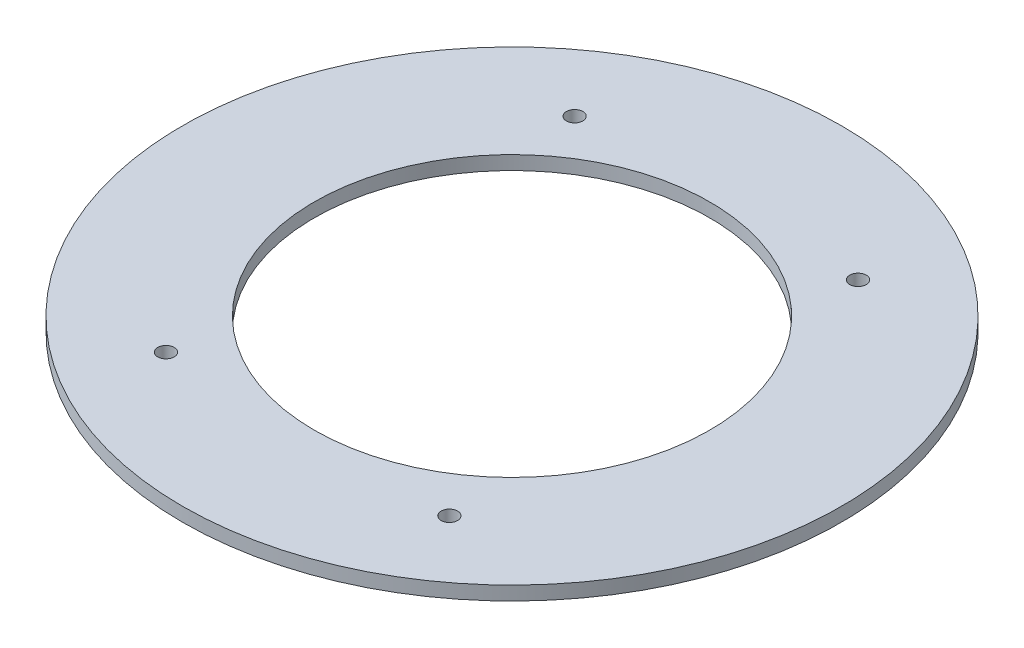
ISO-10303-21;
HEADER;
FILE_DESCRIPTION(('STEP AP214'),'2;1');
FILE_NAME('part.step','',(''),(''),'','','');
FILE_SCHEMA(('AUTOMOTIVE_DESIGN { 1 0 10303 214 1 1 1 1 }'));
ENDSEC;
DATA;
#1=APPLICATION_CONTEXT('core data for automotive mechanical design processes');
#2=APPLICATION_PROTOCOL_DEFINITION('international standard','automotive_design',2000,#1);
#3=PRODUCT_CONTEXT('',#1,'mechanical');
#4=PRODUCT('Part','Part','',(#3));
#5=PRODUCT_RELATED_PRODUCT_CATEGORY('part','',(#4));
#6=PRODUCT_DEFINITION_FORMATION('','',#4);
#7=PRODUCT_DEFINITION_CONTEXT('part definition',#1,'design');
#8=PRODUCT_DEFINITION('design','',#6,#7);
#9=PRODUCT_DEFINITION_SHAPE('','',#8);
#10=(LENGTH_UNIT() NAMED_UNIT(*) SI_UNIT(.MILLI.,.METRE.));
#11=(NAMED_UNIT(*) PLANE_ANGLE_UNIT() SI_UNIT($,.RADIAN.));
#12=(NAMED_UNIT(*) SI_UNIT($,.STERADIAN.) SOLID_ANGLE_UNIT());
#13=UNCERTAINTY_MEASURE_WITH_UNIT(LENGTH_MEASURE(1.E-05),#10,'distance_accuracy_value','');
#14=(GEOMETRIC_REPRESENTATION_CONTEXT(3) GLOBAL_UNCERTAINTY_ASSIGNED_CONTEXT((#13)) GLOBAL_UNIT_ASSIGNED_CONTEXT((#10,
#11,#12)) REPRESENTATION_CONTEXT('',''));
#15=CARTESIAN_POINT('',(0.,0.,0.));
#16=DIRECTION('',(0.,0.,1.));
#17=DIRECTION('',(1.,0.,0.));
#18=AXIS2_PLACEMENT_3D('',#15,#16,#17);
#19=CARTESIAN_POINT('',(0.,5.334,0.));
#20=DIRECTION('',(0.,-1.,0.));
#21=DIRECTION('',(0.,0.,-1.));
#22=AXIS2_PLACEMENT_3D('',#19,#20,#21);
#23=CYLINDRICAL_SURFACE('',#22,127.);
#24=CARTESIAN_POINT('',(0.,5.334,0.));
#25=DIRECTION('',(0.,1.,0.));
#26=DIRECTION('',(0.,0.,1.));
#27=AXIS2_PLACEMENT_3D('',#24,#25,#26);
#28=CIRCLE('',#27,127.);
#29=CARTESIAN_POINT('',(0.,5.334,127.));
#30=VERTEX_POINT('',#29);
#31=EDGE_CURVE('E10',#30,#30,#28,.T.);
#32=ORIENTED_EDGE('',*,*,#31,.F.);
#33=EDGE_LOOP('',(#32));
#34=FACE_BOUND('',#33,.T.);
#35=CARTESIAN_POINT('',(0.,0.,0.));
#36=DIRECTION('',(0.,1.,0.));
#37=DIRECTION('',(0.,0.,1.));
#38=AXIS2_PLACEMENT_3D('',#35,#36,#37);
#39=CIRCLE('',#38,127.);
#40=CARTESIAN_POINT('',(0.,0.,127.));
#41=VERTEX_POINT('',#40);
#42=EDGE_CURVE('E37',#41,#41,#39,.T.);
#43=ORIENTED_EDGE('',*,*,#42,.T.);
#44=EDGE_LOOP('',(#43));
#45=FACE_BOUND('',#44,.T.);
#46=ADVANCED_FACE('F30',(#34,#45),#23,.T.);
#47=CARTESIAN_POINT('',(0.,5.334,0.));
#48=DIRECTION('',(0.,1.,0.));
#49=DIRECTION('',(0.,0.,1.));
#50=AXIS2_PLACEMENT_3D('',#47,#48,#49);
#51=PLANE('',#50);
#52=CARTESIAN_POINT('',(-54.61,5.334,-78.74));
#53=DIRECTION('',(0.,-1.,0.));
#54=DIRECTION('',(0.,0.,1.));
#55=AXIS2_PLACEMENT_3D('',#52,#53,#54);
#56=CIRCLE('',#55,3.175);
#57=CARTESIAN_POINT('',(-54.61,5.334,-81.915));
#58=VERTEX_POINT('',#57);
#59=EDGE_CURVE('E67',#58,#58,#56,.T.);
#60=ORIENTED_EDGE('',*,*,#59,.T.);
#61=EDGE_LOOP('',(#60));
#62=FACE_BOUND('',#61,.T.);
#63=CARTESIAN_POINT('',(54.61,5.334,-78.74));
#64=DIRECTION('',(0.,-1.,0.));
#65=DIRECTION('',(0.,0.,-1.));
#66=AXIS2_PLACEMENT_3D('',#63,#64,#65);
#67=CIRCLE('',#66,3.175);
#68=CARTESIAN_POINT('',(54.61,5.334,-81.915));
#69=VERTEX_POINT('',#68);
#70=EDGE_CURVE('E57',#69,#69,#67,.T.);
#71=ORIENTED_EDGE('',*,*,#70,.T.);
#72=EDGE_LOOP('',(#71));
#73=FACE_BOUND('',#72,.T.);
#74=CARTESIAN_POINT('',(54.61,5.334,78.74));
#75=DIRECTION('',(0.,-1.,0.));
#76=DIRECTION('',(0.,0.,1.));
#77=AXIS2_PLACEMENT_3D('',#74,#75,#76);
#78=CIRCLE('',#77,3.175);
#79=CARTESIAN_POINT('',(54.61,5.334,75.565));
#80=VERTEX_POINT('',#79);
#81=EDGE_CURVE('E54',#80,#80,#78,.T.);
#82=ORIENTED_EDGE('',*,*,#81,.T.);
#83=EDGE_LOOP('',(#82));
#84=FACE_BOUND('',#83,.T.);
#85=CARTESIAN_POINT('',(-54.61,5.334,78.74));
#86=DIRECTION('',(0.,-1.,0.));
#87=DIRECTION('',(0.,0.,-1.));
#88=AXIS2_PLACEMENT_3D('',#85,#86,#87);
#89=CIRCLE('',#88,3.175);
#90=CARTESIAN_POINT('',(-54.61,5.334,75.565));
#91=VERTEX_POINT('',#90);
#92=EDGE_CURVE('E51',#91,#91,#89,.T.);
#93=ORIENTED_EDGE('',*,*,#92,.T.);
#94=EDGE_LOOP('',(#93));
#95=FACE_BOUND('',#94,.T.);
#96=CARTESIAN_POINT('',(0.,5.334,0.));
#97=DIRECTION('',(0.,1.,0.));
#98=DIRECTION('',(0.,0.,1.));
#99=AXIS2_PLACEMENT_3D('',#96,#97,#98);
#100=CIRCLE('',#99,76.2);
#101=CARTESIAN_POINT('',(0.,5.334,76.2));
#102=VERTEX_POINT('',#101);
#103=EDGE_CURVE('E45',#102,#102,#100,.T.);
#104=ORIENTED_EDGE('',*,*,#103,.F.);
#105=EDGE_LOOP('',(#104));
#106=FACE_BOUND('',#105,.T.);
#107=ORIENTED_EDGE('',*,*,#31,.T.);
#108=EDGE_LOOP('',(#107));
#109=FACE_BOUND('',#108,.T.);
#110=ADVANCED_FACE('F79',(#62,#73,#84,#95,#106,#109),#51,.T.);
#111=CARTESIAN_POINT('',(0.,0.,0.));
#112=DIRECTION('',(0.,1.,0.));
#113=DIRECTION('',(0.,0.,1.));
#114=AXIS2_PLACEMENT_3D('',#111,#112,#113);
#115=PLANE('',#114);
#116=CARTESIAN_POINT('',(-54.61,0.,-78.74));
#117=DIRECTION('',(0.,1.,0.));
#118=DIRECTION('',(0.,0.,1.));
#119=AXIS2_PLACEMENT_3D('',#116,#117,#118);
#120=CIRCLE('',#119,3.175);
#121=CARTESIAN_POINT('',(-54.61,0.,-81.915));
#122=VERTEX_POINT('',#121);
#123=EDGE_CURVE('E33',#122,#122,#120,.T.);
#124=ORIENTED_EDGE('',*,*,#123,.T.);
#125=EDGE_LOOP('',(#124));
#126=FACE_BOUND('',#125,.T.);
#127=CARTESIAN_POINT('',(54.61,0.,-78.74));
#128=DIRECTION('',(0.,1.,0.));
#129=DIRECTION('',(0.,0.,1.));
#130=AXIS2_PLACEMENT_3D('',#127,#128,#129);
#131=CIRCLE('',#130,3.175);
#132=CARTESIAN_POINT('',(54.61,0.,-81.915));
#133=VERTEX_POINT('',#132);
#134=EDGE_CURVE('E55',#133,#133,#131,.T.);
#135=ORIENTED_EDGE('',*,*,#134,.T.);
#136=EDGE_LOOP('',(#135));
#137=FACE_BOUND('',#136,.T.);
#138=CARTESIAN_POINT('',(54.61,0.,78.74));
#139=DIRECTION('',(0.,1.,0.));
#140=DIRECTION('',(0.,0.,1.));
#141=AXIS2_PLACEMENT_3D('',#138,#139,#140);
#142=CIRCLE('',#141,3.175);
#143=CARTESIAN_POINT('',(54.61,0.,75.565));
#144=VERTEX_POINT('',#143);
#145=EDGE_CURVE('E52',#144,#144,#142,.T.);
#146=ORIENTED_EDGE('',*,*,#145,.T.);
#147=EDGE_LOOP('',(#146));
#148=FACE_BOUND('',#147,.T.);
#149=CARTESIAN_POINT('',(-54.61,0.,78.74));
#150=DIRECTION('',(0.,1.,0.));
#151=DIRECTION('',(0.,0.,1.));
#152=AXIS2_PLACEMENT_3D('',#149,#150,#151);
#153=CIRCLE('',#152,3.175);
#154=CARTESIAN_POINT('',(-54.61,0.,75.565));
#155=VERTEX_POINT('',#154);
#156=EDGE_CURVE('E48',#155,#155,#153,.T.);
#157=ORIENTED_EDGE('',*,*,#156,.T.);
#158=EDGE_LOOP('',(#157));
#159=FACE_BOUND('',#158,.T.);
#160=CARTESIAN_POINT('',(0.,0.,0.));
#161=DIRECTION('',(0.,1.,0.));
#162=DIRECTION('',(0.,0.,1.));
#163=AXIS2_PLACEMENT_3D('',#160,#161,#162);
#164=CIRCLE('',#163,76.2);
#165=CARTESIAN_POINT('',(0.,0.,76.2));
#166=VERTEX_POINT('',#165);
#167=EDGE_CURVE('E42',#166,#166,#164,.T.);
#168=ORIENTED_EDGE('',*,*,#167,.T.);
#169=EDGE_LOOP('',(#168));
#170=FACE_BOUND('',#169,.T.);
#171=ORIENTED_EDGE('',*,*,#42,.F.);
#172=EDGE_LOOP('',(#171));
#173=FACE_BOUND('',#172,.T.);
#174=ADVANCED_FACE('F81',(#126,#137,#148,#159,#170,#173),#115,.F.);
#175=CARTESIAN_POINT('',(0.,0.,0.));
#176=DIRECTION('',(0.,1.,0.));
#177=DIRECTION('',(0.,0.,1.));
#178=AXIS2_PLACEMENT_3D('',#175,#176,#177);
#179=CYLINDRICAL_SURFACE('',#178,76.2);
#180=ORIENTED_EDGE('',*,*,#167,.F.);
#181=EDGE_LOOP('',(#180));
#182=FACE_BOUND('',#181,.T.);
#183=ORIENTED_EDGE('',*,*,#103,.T.);
#184=EDGE_LOOP('',(#183));
#185=FACE_BOUND('',#184,.T.);
#186=ADVANCED_FACE('F77',(#182,#185),#179,.F.);
#187=CARTESIAN_POINT('',(-54.61,5.334,78.74));
#188=DIRECTION('',(0.,-1.,0.));
#189=DIRECTION('',(0.,0.,-1.));
#190=AXIS2_PLACEMENT_3D('',#187,#188,#189);
#191=CYLINDRICAL_SURFACE('',#190,3.175);
#192=CARTESIAN_POINT('',(-54.61,5.334,75.565));
#193=CARTESIAN_POINT('',(-54.61,5.2784375,75.565));
#194=CARTESIAN_POINT('',(-54.61,5.222875,75.565));
#195=CARTESIAN_POINT('',(-54.61,5.11175,75.565));
#196=CARTESIAN_POINT('',(-54.61,5.0561875,75.565));
#197=CARTESIAN_POINT('',(-54.61,4.9450625,75.565));
#198=CARTESIAN_POINT('',(-54.61,4.8895,75.565));
#199=CARTESIAN_POINT('',(-54.61,4.778375,75.565));
#200=CARTESIAN_POINT('',(-54.61,4.7228125,75.565));
#201=CARTESIAN_POINT('',(-54.61,4.6116875,75.565));
#202=CARTESIAN_POINT('',(-54.61,4.556125,75.565));
#203=CARTESIAN_POINT('',(-54.61,4.445,75.565));
#204=CARTESIAN_POINT('',(-54.61,4.3894375,75.565));
#205=CARTESIAN_POINT('',(-54.61,4.2783125,75.565));
#206=CARTESIAN_POINT('',(-54.61,4.22275,75.565));
#207=CARTESIAN_POINT('',(-54.61,4.111625,75.565));
#208=CARTESIAN_POINT('',(-54.61,4.0560625,75.565));
#209=CARTESIAN_POINT('',(-54.61,3.9449375,75.565));
#210=CARTESIAN_POINT('',(-54.61,3.889375,75.565));
#211=CARTESIAN_POINT('',(-54.61,3.77825,75.565));
#212=CARTESIAN_POINT('',(-54.61,3.7226875,75.565));
#213=CARTESIAN_POINT('',(-54.61,3.6115625,75.565));
#214=CARTESIAN_POINT('',(-54.61,3.556,75.565));
#215=CARTESIAN_POINT('',(-54.61,3.444875,75.565));
#216=CARTESIAN_POINT('',(-54.61,3.3893125,75.565));
#217=CARTESIAN_POINT('',(-54.61,3.2781875,75.565));
#218=CARTESIAN_POINT('',(-54.61,3.222625,75.565));
#219=CARTESIAN_POINT('',(-54.61,3.1115,75.565));
#220=CARTESIAN_POINT('',(-54.61,3.0559375,75.565));
#221=CARTESIAN_POINT('',(-54.61,2.9448125,75.565));
#222=CARTESIAN_POINT('',(-54.61,2.88925,75.565));
#223=CARTESIAN_POINT('',(-54.61,2.778125,75.565));
#224=CARTESIAN_POINT('',(-54.61,2.7225625,75.565));
#225=CARTESIAN_POINT('',(-54.61,2.6114375,75.565));
#226=CARTESIAN_POINT('',(-54.61,2.555875,75.565));
#227=CARTESIAN_POINT('',(-54.61,2.44475,75.565));
#228=CARTESIAN_POINT('',(-54.61,2.3891875,75.565));
#229=CARTESIAN_POINT('',(-54.61,2.2780625,75.565));
#230=CARTESIAN_POINT('',(-54.61,2.2225,75.565));
#231=CARTESIAN_POINT('',(-54.61,2.111375,75.565));
#232=CARTESIAN_POINT('',(-54.61,2.0558125,75.565));
#233=CARTESIAN_POINT('',(-54.61,1.9446875,75.565));
#234=CARTESIAN_POINT('',(-54.61,1.889125,75.565));
#235=CARTESIAN_POINT('',(-54.61,1.778,75.565));
#236=CARTESIAN_POINT('',(-54.61,1.7224375,75.565));
#237=CARTESIAN_POINT('',(-54.61,1.6113125,75.565));
#238=CARTESIAN_POINT('',(-54.61,1.55575,75.565));
#239=CARTESIAN_POINT('',(-54.61,1.444625,75.565));
#240=CARTESIAN_POINT('',(-54.61,1.3890625,75.565));
#241=CARTESIAN_POINT('',(-54.61,1.2779375,75.565));
#242=CARTESIAN_POINT('',(-54.61,1.222375,75.565));
#243=CARTESIAN_POINT('',(-54.61,1.11125,75.565));
#244=CARTESIAN_POINT('',(-54.61,1.0556875,75.565));
#245=CARTESIAN_POINT('',(-54.61,0.944562499999999,75.565));
#246=CARTESIAN_POINT('',(-54.61,0.888999999999999,75.565));
#247=CARTESIAN_POINT('',(-54.61,0.777874999999999,75.565));
#248=CARTESIAN_POINT('',(-54.61,0.722312499999999,75.565));
#249=CARTESIAN_POINT('',(-54.61,0.611187499999999,75.565));
#250=CARTESIAN_POINT('',(-54.61,0.555624999999999,75.565));
#251=CARTESIAN_POINT('',(-54.61,0.444499999999999,75.565));
#252=CARTESIAN_POINT('',(-54.61,0.388937499999999,75.565));
#253=CARTESIAN_POINT('',(-54.61,0.277812499999999,75.565));
#254=CARTESIAN_POINT('',(-54.61,0.222249999999999,75.565));
#255=CARTESIAN_POINT('',(-54.61,0.111124999999999,75.565));
#256=CARTESIAN_POINT('',(-54.61,0.0555624999999992,75.565));
#257=CARTESIAN_POINT('',(-54.61,0.,75.565));
#258=B_SPLINE_CURVE_WITH_KNOTS('',3,(#192,#193,#194,#195,#196,#197,#198,#199,#200,#201,#202,
#203,#204,#205,#206,#207,#208,#209,#210,#211,#212,#213,#214,#215,#216,#217,#218,#219,#220,#221,
#222,#223,#224,#225,#226,#227,#228,#229,#230,#231,#232,#233,#234,#235,#236,#237,#238,#239,#240,
#241,#242,#243,#244,#245,#246,#247,#248,#249,#250,#251,#252,#253,#254,#255,#256,#257),
.UNSPECIFIED.,.F.,.F.,(4,2,2,2,2,2,2,2,2,2,2,2,2,2,2,2,2,2,2,2,2,2,2,2,2,2,2,2,2,2,2,2,4),(0.,
0.166687499999999,0.333374999999999,0.5000625,0.66675,0.833437499999999,1.000125,1.1668125,
1.3335,1.5001875,1.666875,1.8335625,2.00025,2.1669375,2.333625,2.5003125,2.667,2.8336875,
3.000375,3.1670625,3.33375,3.5004375,3.667125,3.8338125,4.0005,4.1671875,4.333875,4.5005625,
4.66725,4.8339375,5.000625,5.1673125,5.334),.UNSPECIFIED.);
#259=EDGE_CURVE('BSEAM94',#91,#155,#258,.T.);
#260=ORIENTED_EDGE('',*,*,#92,.F.);
#261=ORIENTED_EDGE('',*,*,#156,.F.);
#262=ORIENTED_EDGE('',*,*,#259,.T.);
#263=ORIENTED_EDGE('',*,*,#259,.F.);
#264=EDGE_LOOP('',(#260,#262,#261,#263));
#265=FACE_BOUND('',#264,.T.);
#266=ADVANCED_FACE('F94',(#265),#191,.F.);
#267=CARTESIAN_POINT('',(54.61,5.334,78.74));
#268=DIRECTION('',(0.,-1.,0.));
#269=DIRECTION('',(0.,0.,-1.));
#270=AXIS2_PLACEMENT_3D('',#267,#268,#269);
#271=CYLINDRICAL_SURFACE('',#270,3.175);
#272=CARTESIAN_POINT('',(54.61,5.334,75.565));
#273=CARTESIAN_POINT('',(54.61,5.2784375,75.565));
#274=CARTESIAN_POINT('',(54.61,5.222875,75.565));
#275=CARTESIAN_POINT('',(54.61,5.11175,75.565));
#276=CARTESIAN_POINT('',(54.61,5.0561875,75.565));
#277=CARTESIAN_POINT('',(54.61,4.9450625,75.565));
#278=CARTESIAN_POINT('',(54.61,4.8895,75.565));
#279=CARTESIAN_POINT('',(54.61,4.778375,75.565));
#280=CARTESIAN_POINT('',(54.61,4.7228125,75.565));
#281=CARTESIAN_POINT('',(54.61,4.6116875,75.565));
#282=CARTESIAN_POINT('',(54.61,4.556125,75.565));
#283=CARTESIAN_POINT('',(54.61,4.445,75.565));
#284=CARTESIAN_POINT('',(54.61,4.3894375,75.565));
#285=CARTESIAN_POINT('',(54.61,4.2783125,75.565));
#286=CARTESIAN_POINT('',(54.61,4.22275,75.565));
#287=CARTESIAN_POINT('',(54.61,4.111625,75.565));
#288=CARTESIAN_POINT('',(54.61,4.0560625,75.565));
#289=CARTESIAN_POINT('',(54.61,3.9449375,75.565));
#290=CARTESIAN_POINT('',(54.61,3.889375,75.565));
#291=CARTESIAN_POINT('',(54.61,3.77825,75.565));
#292=CARTESIAN_POINT('',(54.61,3.7226875,75.565));
#293=CARTESIAN_POINT('',(54.61,3.6115625,75.565));
#294=CARTESIAN_POINT('',(54.61,3.556,75.565));
#295=CARTESIAN_POINT('',(54.61,3.444875,75.565));
#296=CARTESIAN_POINT('',(54.61,3.3893125,75.565));
#297=CARTESIAN_POINT('',(54.61,3.2781875,75.565));
#298=CARTESIAN_POINT('',(54.61,3.222625,75.565));
#299=CARTESIAN_POINT('',(54.61,3.1115,75.565));
#300=CARTESIAN_POINT('',(54.61,3.0559375,75.565));
#301=CARTESIAN_POINT('',(54.61,2.9448125,75.565));
#302=CARTESIAN_POINT('',(54.61,2.88925,75.565));
#303=CARTESIAN_POINT('',(54.61,2.778125,75.565));
#304=CARTESIAN_POINT('',(54.61,2.7225625,75.565));
#305=CARTESIAN_POINT('',(54.61,2.6114375,75.565));
#306=CARTESIAN_POINT('',(54.61,2.555875,75.565));
#307=CARTESIAN_POINT('',(54.61,2.44475,75.565));
#308=CARTESIAN_POINT('',(54.61,2.3891875,75.565));
#309=CARTESIAN_POINT('',(54.61,2.2780625,75.565));
#310=CARTESIAN_POINT('',(54.61,2.2225,75.565));
#311=CARTESIAN_POINT('',(54.61,2.111375,75.565));
#312=CARTESIAN_POINT('',(54.61,2.0558125,75.565));
#313=CARTESIAN_POINT('',(54.61,1.9446875,75.565));
#314=CARTESIAN_POINT('',(54.61,1.889125,75.565));
#315=CARTESIAN_POINT('',(54.61,1.778,75.565));
#316=CARTESIAN_POINT('',(54.61,1.7224375,75.565));
#317=CARTESIAN_POINT('',(54.61,1.6113125,75.565));
#318=CARTESIAN_POINT('',(54.61,1.55575,75.565));
#319=CARTESIAN_POINT('',(54.61,1.444625,75.565));
#320=CARTESIAN_POINT('',(54.61,1.3890625,75.565));
#321=CARTESIAN_POINT('',(54.61,1.2779375,75.565));
#322=CARTESIAN_POINT('',(54.61,1.222375,75.565));
#323=CARTESIAN_POINT('',(54.61,1.11125,75.565));
#324=CARTESIAN_POINT('',(54.61,1.0556875,75.565));
#325=CARTESIAN_POINT('',(54.61,0.944562499999999,75.565));
#326=CARTESIAN_POINT('',(54.61,0.888999999999999,75.565));
#327=CARTESIAN_POINT('',(54.61,0.777874999999999,75.565));
#328=CARTESIAN_POINT('',(54.61,0.722312499999999,75.565));
#329=CARTESIAN_POINT('',(54.61,0.611187499999999,75.565));
#330=CARTESIAN_POINT('',(54.61,0.555624999999999,75.565));
#331=CARTESIAN_POINT('',(54.61,0.444499999999999,75.565));
#332=CARTESIAN_POINT('',(54.61,0.388937499999999,75.565));
#333=CARTESIAN_POINT('',(54.61,0.277812499999999,75.565));
#334=CARTESIAN_POINT('',(54.61,0.222249999999999,75.565));
#335=CARTESIAN_POINT('',(54.61,0.111124999999999,75.565));
#336=CARTESIAN_POINT('',(54.61,0.0555624999999992,75.565));
#337=CARTESIAN_POINT('',(54.61,0.,75.565));
#338=B_SPLINE_CURVE_WITH_KNOTS('',3,(#272,#273,#274,#275,#276,#277,#278,#279,#280,#281,#282,
#283,#284,#285,#286,#287,#288,#289,#290,#291,#292,#293,#294,#295,#296,#297,#298,#299,#300,#301,
#302,#303,#304,#305,#306,#307,#308,#309,#310,#311,#312,#313,#314,#315,#316,#317,#318,#319,#320,
#321,#322,#323,#324,#325,#326,#327,#328,#329,#330,#331,#332,#333,#334,#335,#336,#337),
.UNSPECIFIED.,.F.,.F.,(4,2,2,2,2,2,2,2,2,2,2,2,2,2,2,2,2,2,2,2,2,2,2,2,2,2,2,2,2,2,2,2,4),(0.,
0.166687499999999,0.333374999999999,0.5000625,0.66675,0.833437499999999,1.000125,1.1668125,
1.3335,1.5001875,1.666875,1.8335625,2.00025,2.1669375,2.333625,2.5003125,2.667,2.8336875,
3.000375,3.1670625,3.33375,3.5004375,3.667125,3.8338125,4.0005,4.1671875,4.333875,4.5005625,
4.66725,4.8339375,5.000625,5.1673125,5.334),.UNSPECIFIED.);
#339=EDGE_CURVE('BSEAM98',#80,#144,#338,.T.);
#340=ORIENTED_EDGE('',*,*,#81,.F.);
#341=ORIENTED_EDGE('',*,*,#145,.F.);
#342=ORIENTED_EDGE('',*,*,#339,.T.);
#343=ORIENTED_EDGE('',*,*,#339,.F.);
#344=EDGE_LOOP('',(#340,#342,#341,#343));
#345=FACE_BOUND('',#344,.T.);
#346=ADVANCED_FACE('F98',(#345),#271,.F.);
#347=CARTESIAN_POINT('',(54.61,5.334,-78.74));
#348=DIRECTION('',(0.,-1.,0.));
#349=DIRECTION('',(0.,0.,-1.));
#350=AXIS2_PLACEMENT_3D('',#347,#348,#349);
#351=CYLINDRICAL_SURFACE('',#350,3.175);
#352=CARTESIAN_POINT('',(54.61,5.334,-81.915));
#353=CARTESIAN_POINT('',(54.61,5.2784375,-81.915));
#354=CARTESIAN_POINT('',(54.61,5.222875,-81.915));
#355=CARTESIAN_POINT('',(54.61,5.11175,-81.915));
#356=CARTESIAN_POINT('',(54.61,5.0561875,-81.915));
#357=CARTESIAN_POINT('',(54.61,4.9450625,-81.915));
#358=CARTESIAN_POINT('',(54.61,4.8895,-81.915));
#359=CARTESIAN_POINT('',(54.61,4.778375,-81.915));
#360=CARTESIAN_POINT('',(54.61,4.7228125,-81.915));
#361=CARTESIAN_POINT('',(54.61,4.6116875,-81.915));
#362=CARTESIAN_POINT('',(54.61,4.556125,-81.915));
#363=CARTESIAN_POINT('',(54.61,4.445,-81.915));
#364=CARTESIAN_POINT('',(54.61,4.3894375,-81.915));
#365=CARTESIAN_POINT('',(54.61,4.2783125,-81.915));
#366=CARTESIAN_POINT('',(54.61,4.22275,-81.915));
#367=CARTESIAN_POINT('',(54.61,4.111625,-81.915));
#368=CARTESIAN_POINT('',(54.61,4.0560625,-81.915));
#369=CARTESIAN_POINT('',(54.61,3.9449375,-81.915));
#370=CARTESIAN_POINT('',(54.61,3.889375,-81.915));
#371=CARTESIAN_POINT('',(54.61,3.77825,-81.915));
#372=CARTESIAN_POINT('',(54.61,3.7226875,-81.915));
#373=CARTESIAN_POINT('',(54.61,3.6115625,-81.915));
#374=CARTESIAN_POINT('',(54.61,3.556,-81.915));
#375=CARTESIAN_POINT('',(54.61,3.444875,-81.915));
#376=CARTESIAN_POINT('',(54.61,3.3893125,-81.915));
#377=CARTESIAN_POINT('',(54.61,3.2781875,-81.915));
#378=CARTESIAN_POINT('',(54.61,3.222625,-81.915));
#379=CARTESIAN_POINT('',(54.61,3.1115,-81.915));
#380=CARTESIAN_POINT('',(54.61,3.0559375,-81.915));
#381=CARTESIAN_POINT('',(54.61,2.9448125,-81.915));
#382=CARTESIAN_POINT('',(54.61,2.88925,-81.915));
#383=CARTESIAN_POINT('',(54.61,2.778125,-81.915));
#384=CARTESIAN_POINT('',(54.61,2.7225625,-81.915));
#385=CARTESIAN_POINT('',(54.61,2.6114375,-81.915));
#386=CARTESIAN_POINT('',(54.61,2.555875,-81.915));
#387=CARTESIAN_POINT('',(54.61,2.44475,-81.915));
#388=CARTESIAN_POINT('',(54.61,2.3891875,-81.915));
#389=CARTESIAN_POINT('',(54.61,2.2780625,-81.915));
#390=CARTESIAN_POINT('',(54.61,2.2225,-81.915));
#391=CARTESIAN_POINT('',(54.61,2.111375,-81.915));
#392=CARTESIAN_POINT('',(54.61,2.0558125,-81.915));
#393=CARTESIAN_POINT('',(54.61,1.9446875,-81.915));
#394=CARTESIAN_POINT('',(54.61,1.889125,-81.915));
#395=CARTESIAN_POINT('',(54.61,1.778,-81.915));
#396=CARTESIAN_POINT('',(54.61,1.7224375,-81.915));
#397=CARTESIAN_POINT('',(54.61,1.6113125,-81.915));
#398=CARTESIAN_POINT('',(54.61,1.55575,-81.915));
#399=CARTESIAN_POINT('',(54.61,1.444625,-81.915));
#400=CARTESIAN_POINT('',(54.61,1.3890625,-81.915));
#401=CARTESIAN_POINT('',(54.61,1.2779375,-81.915));
#402=CARTESIAN_POINT('',(54.61,1.222375,-81.915));
#403=CARTESIAN_POINT('',(54.61,1.11125,-81.915));
#404=CARTESIAN_POINT('',(54.61,1.0556875,-81.915));
#405=CARTESIAN_POINT('',(54.61,0.944562499999999,-81.915));
#406=CARTESIAN_POINT('',(54.61,0.888999999999999,-81.915));
#407=CARTESIAN_POINT('',(54.61,0.777874999999999,-81.915));
#408=CARTESIAN_POINT('',(54.61,0.722312499999999,-81.915));
#409=CARTESIAN_POINT('',(54.61,0.611187499999999,-81.915));
#410=CARTESIAN_POINT('',(54.61,0.555624999999999,-81.915));
#411=CARTESIAN_POINT('',(54.61,0.444499999999999,-81.915));
#412=CARTESIAN_POINT('',(54.61,0.388937499999999,-81.915));
#413=CARTESIAN_POINT('',(54.61,0.277812499999999,-81.915));
#414=CARTESIAN_POINT('',(54.61,0.222249999999999,-81.915));
#415=CARTESIAN_POINT('',(54.61,0.111124999999999,-81.915));
#416=CARTESIAN_POINT('',(54.61,0.0555624999999992,-81.915));
#417=CARTESIAN_POINT('',(54.61,0.,-81.915));
#418=B_SPLINE_CURVE_WITH_KNOTS('',3,(#352,#353,#354,#355,#356,#357,#358,#359,#360,#361,#362,
#363,#364,#365,#366,#367,#368,#369,#370,#371,#372,#373,#374,#375,#376,#377,#378,#379,#380,#381,
#382,#383,#384,#385,#386,#387,#388,#389,#390,#391,#392,#393,#394,#395,#396,#397,#398,#399,#400,
#401,#402,#403,#404,#405,#406,#407,#408,#409,#410,#411,#412,#413,#414,#415,#416,#417),
.UNSPECIFIED.,.F.,.F.,(4,2,2,2,2,2,2,2,2,2,2,2,2,2,2,2,2,2,2,2,2,2,2,2,2,2,2,2,2,2,2,2,4),(0.,
0.166687499999999,0.333374999999999,0.5000625,0.66675,0.833437499999999,1.000125,1.1668125,
1.3335,1.5001875,1.666875,1.8335625,2.00025,2.1669375,2.333625,2.5003125,2.667,2.8336875,
3.000375,3.1670625,3.33375,3.5004375,3.667125,3.8338125,4.0005,4.1671875,4.333875,4.5005625,
4.66725,4.8339375,5.000625,5.1673125,5.334),.UNSPECIFIED.);
#419=EDGE_CURVE('BSEAM102',#69,#133,#418,.T.);
#420=ORIENTED_EDGE('',*,*,#70,.F.);
#421=ORIENTED_EDGE('',*,*,#134,.F.);
#422=ORIENTED_EDGE('',*,*,#419,.T.);
#423=ORIENTED_EDGE('',*,*,#419,.F.);
#424=EDGE_LOOP('',(#420,#422,#421,#423));
#425=FACE_BOUND('',#424,.T.);
#426=ADVANCED_FACE('F102',(#425),#351,.F.);
#427=CARTESIAN_POINT('',(-54.61,5.334,-78.74));
#428=DIRECTION('',(0.,-1.,0.));
#429=DIRECTION('',(0.,0.,-1.));
#430=AXIS2_PLACEMENT_3D('',#427,#428,#429);
#431=CYLINDRICAL_SURFACE('',#430,3.175);
#432=CARTESIAN_POINT('',(-54.61,5.334,-81.915));
#433=CARTESIAN_POINT('',(-54.61,5.2784375,-81.915));
#434=CARTESIAN_POINT('',(-54.61,5.222875,-81.915));
#435=CARTESIAN_POINT('',(-54.61,5.11175,-81.915));
#436=CARTESIAN_POINT('',(-54.61,5.0561875,-81.915));
#437=CARTESIAN_POINT('',(-54.61,4.9450625,-81.915));
#438=CARTESIAN_POINT('',(-54.61,4.8895,-81.915));
#439=CARTESIAN_POINT('',(-54.61,4.778375,-81.915));
#440=CARTESIAN_POINT('',(-54.61,4.7228125,-81.915));
#441=CARTESIAN_POINT('',(-54.61,4.6116875,-81.915));
#442=CARTESIAN_POINT('',(-54.61,4.556125,-81.915));
#443=CARTESIAN_POINT('',(-54.61,4.445,-81.915));
#444=CARTESIAN_POINT('',(-54.61,4.3894375,-81.915));
#445=CARTESIAN_POINT('',(-54.61,4.2783125,-81.915));
#446=CARTESIAN_POINT('',(-54.61,4.22275,-81.915));
#447=CARTESIAN_POINT('',(-54.61,4.111625,-81.915));
#448=CARTESIAN_POINT('',(-54.61,4.0560625,-81.915));
#449=CARTESIAN_POINT('',(-54.61,3.9449375,-81.915));
#450=CARTESIAN_POINT('',(-54.61,3.889375,-81.915));
#451=CARTESIAN_POINT('',(-54.61,3.77825,-81.915));
#452=CARTESIAN_POINT('',(-54.61,3.7226875,-81.915));
#453=CARTESIAN_POINT('',(-54.61,3.6115625,-81.915));
#454=CARTESIAN_POINT('',(-54.61,3.556,-81.915));
#455=CARTESIAN_POINT('',(-54.61,3.444875,-81.915));
#456=CARTESIAN_POINT('',(-54.61,3.3893125,-81.915));
#457=CARTESIAN_POINT('',(-54.61,3.2781875,-81.915));
#458=CARTESIAN_POINT('',(-54.61,3.222625,-81.915));
#459=CARTESIAN_POINT('',(-54.61,3.1115,-81.915));
#460=CARTESIAN_POINT('',(-54.61,3.0559375,-81.915));
#461=CARTESIAN_POINT('',(-54.61,2.9448125,-81.915));
#462=CARTESIAN_POINT('',(-54.61,2.88925,-81.915));
#463=CARTESIAN_POINT('',(-54.61,2.778125,-81.915));
#464=CARTESIAN_POINT('',(-54.61,2.7225625,-81.915));
#465=CARTESIAN_POINT('',(-54.61,2.6114375,-81.915));
#466=CARTESIAN_POINT('',(-54.61,2.555875,-81.915));
#467=CARTESIAN_POINT('',(-54.61,2.44475,-81.915));
#468=CARTESIAN_POINT('',(-54.61,2.3891875,-81.915));
#469=CARTESIAN_POINT('',(-54.61,2.2780625,-81.915));
#470=CARTESIAN_POINT('',(-54.61,2.2225,-81.915));
#471=CARTESIAN_POINT('',(-54.61,2.111375,-81.915));
#472=CARTESIAN_POINT('',(-54.61,2.0558125,-81.915));
#473=CARTESIAN_POINT('',(-54.61,1.9446875,-81.915));
#474=CARTESIAN_POINT('',(-54.61,1.889125,-81.915));
#475=CARTESIAN_POINT('',(-54.61,1.778,-81.915));
#476=CARTESIAN_POINT('',(-54.61,1.7224375,-81.915));
#477=CARTESIAN_POINT('',(-54.61,1.6113125,-81.915));
#478=CARTESIAN_POINT('',(-54.61,1.55575,-81.915));
#479=CARTESIAN_POINT('',(-54.61,1.444625,-81.915));
#480=CARTESIAN_POINT('',(-54.61,1.3890625,-81.915));
#481=CARTESIAN_POINT('',(-54.61,1.2779375,-81.915));
#482=CARTESIAN_POINT('',(-54.61,1.222375,-81.915));
#483=CARTESIAN_POINT('',(-54.61,1.11125,-81.915));
#484=CARTESIAN_POINT('',(-54.61,1.0556875,-81.915));
#485=CARTESIAN_POINT('',(-54.61,0.944562499999999,-81.915));
#486=CARTESIAN_POINT('',(-54.61,0.888999999999999,-81.915));
#487=CARTESIAN_POINT('',(-54.61,0.777874999999999,-81.915));
#488=CARTESIAN_POINT('',(-54.61,0.722312499999999,-81.915));
#489=CARTESIAN_POINT('',(-54.61,0.611187499999999,-81.915));
#490=CARTESIAN_POINT('',(-54.61,0.555624999999999,-81.915));
#491=CARTESIAN_POINT('',(-54.61,0.444499999999999,-81.915));
#492=CARTESIAN_POINT('',(-54.61,0.388937499999999,-81.915));
#493=CARTESIAN_POINT('',(-54.61,0.277812499999999,-81.915));
#494=CARTESIAN_POINT('',(-54.61,0.222249999999999,-81.915));
#495=CARTESIAN_POINT('',(-54.61,0.111124999999999,-81.915));
#496=CARTESIAN_POINT('',(-54.61,0.0555624999999992,-81.915));
#497=CARTESIAN_POINT('',(-54.61,0.,-81.915));
#498=B_SPLINE_CURVE_WITH_KNOTS('',3,(#432,#433,#434,#435,#436,#437,#438,#439,#440,#441,#442,
#443,#444,#445,#446,#447,#448,#449,#450,#451,#452,#453,#454,#455,#456,#457,#458,#459,#460,#461,
#462,#463,#464,#465,#466,#467,#468,#469,#470,#471,#472,#473,#474,#475,#476,#477,#478,#479,#480,
#481,#482,#483,#484,#485,#486,#487,#488,#489,#490,#491,#492,#493,#494,#495,#496,#497),
.UNSPECIFIED.,.F.,.F.,(4,2,2,2,2,2,2,2,2,2,2,2,2,2,2,2,2,2,2,2,2,2,2,2,2,2,2,2,2,2,2,2,4),(0.,
0.166687499999999,0.333374999999999,0.5000625,0.66675,0.833437499999999,1.000125,1.1668125,
1.3335,1.5001875,1.666875,1.8335625,2.00025,2.1669375,2.333625,2.5003125,2.667,2.8336875,
3.000375,3.1670625,3.33375,3.5004375,3.667125,3.8338125,4.0005,4.1671875,4.333875,4.5005625,
4.66725,4.8339375,5.000625,5.1673125,5.334),.UNSPECIFIED.);
#499=EDGE_CURVE('BSEAM106',#58,#122,#498,.T.);
#500=ORIENTED_EDGE('',*,*,#59,.F.);
#501=ORIENTED_EDGE('',*,*,#123,.F.);
#502=ORIENTED_EDGE('',*,*,#499,.T.);
#503=ORIENTED_EDGE('',*,*,#499,.F.);
#504=EDGE_LOOP('',(#500,#502,#501,#503));
#505=FACE_BOUND('',#504,.T.);
#506=ADVANCED_FACE('F106',(#505),#431,.F.);
#507=CLOSED_SHELL('',(#46,#110,#174,#186,#266,#346,#426,#506));
#508=MANIFOLD_SOLID_BREP('B2',#507);
#509=ADVANCED_BREP_SHAPE_REPRESENTATION('',(#18,#508),#14);
#510=SHAPE_DEFINITION_REPRESENTATION(#9,#509);
ENDSEC;
END-ISO-10303-21;
